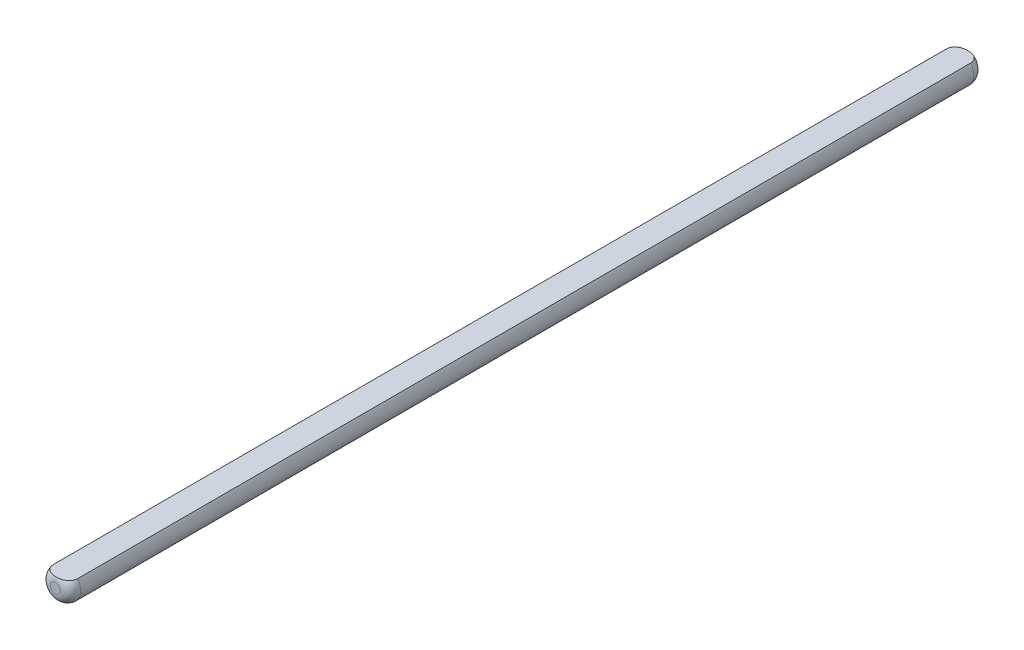
ISO-10303-21;
HEADER;
FILE_DESCRIPTION(('STEP AP214'),'2;1');
FILE_NAME('part.step','',(''),(''),'','','');
FILE_SCHEMA(('AUTOMOTIVE_DESIGN { 1 0 10303 214 1 1 1 1 }'));
ENDSEC;
DATA;
#1=APPLICATION_CONTEXT('core data for automotive mechanical design processes');
#2=APPLICATION_PROTOCOL_DEFINITION('international standard','automotive_design',2000,#1);
#3=PRODUCT_CONTEXT('',#1,'mechanical');
#4=PRODUCT('Part','Part','',(#3));
#5=PRODUCT_RELATED_PRODUCT_CATEGORY('part','',(#4));
#6=PRODUCT_DEFINITION_FORMATION('','',#4);
#7=PRODUCT_DEFINITION_CONTEXT('part definition',#1,'design');
#8=PRODUCT_DEFINITION('design','',#6,#7);
#9=PRODUCT_DEFINITION_SHAPE('','',#8);
#10=(LENGTH_UNIT() NAMED_UNIT(*) SI_UNIT(.MILLI.,.METRE.));
#11=(NAMED_UNIT(*) PLANE_ANGLE_UNIT() SI_UNIT($,.RADIAN.));
#12=(NAMED_UNIT(*) SI_UNIT($,.STERADIAN.) SOLID_ANGLE_UNIT());
#13=UNCERTAINTY_MEASURE_WITH_UNIT(LENGTH_MEASURE(1.E-05),#10,'distance_accuracy_value','');
#14=(GEOMETRIC_REPRESENTATION_CONTEXT(3) GLOBAL_UNCERTAINTY_ASSIGNED_CONTEXT((#13)) GLOBAL_UNIT_ASSIGNED_CONTEXT((#10,
#11,#12)) REPRESENTATION_CONTEXT('',''));
#15=CARTESIAN_POINT('',(0.,0.,0.));
#16=DIRECTION('',(0.,0.,1.));
#17=DIRECTION('',(1.,0.,0.));
#18=AXIS2_PLACEMENT_3D('',#15,#16,#17);
#19=CARTESIAN_POINT('',(0.,0.,180.));
#20=DIRECTION('',(0.,0.,-1.));
#21=DIRECTION('',(-1.,0.,0.));
#22=AXIS2_PLACEMENT_3D('',#19,#20,#21);
#23=CYLINDRICAL_SURFACE('',#22,3.);
#24=CARTESIAN_POINT('',(0.,0.,178.));
#25=DIRECTION('',(0.,0.,1.));
#26=DIRECTION('',(1.,0.,0.));
#27=AXIS2_PLACEMENT_3D('',#24,#25,#26);
#28=CIRCLE('',#27,3.);
#29=CARTESIAN_POINT('',(2.4,1.8,178.));
#30=VERTEX_POINT('',#29);
#31=CARTESIAN_POINT('',(-2.4,1.8,178.));
#32=VERTEX_POINT('',#31);
#33=EDGE_CURVE('E71',#30,#32,#28,.F.);
#34=ORIENTED_EDGE('',*,*,#33,.T.);
#35=DIRECTION('',(0.,0.,-1.));
#36=VECTOR('',#35,1.);
#37=CARTESIAN_POINT('',(-2.4,1.8,180.));
#38=LINE('',#37,#36);
#39=CARTESIAN_POINT('',(-2.4,1.8,1.99999999999989));
#40=VERTEX_POINT('',#39);
#41=EDGE_CURVE('E54',#32,#40,#38,.T.);
#42=ORIENTED_EDGE('',*,*,#41,.T.);
#43=CARTESIAN_POINT('',(0.,0.,1.99999999999989));
#44=DIRECTION('',(0.,0.,1.));
#45=DIRECTION('',(1.,0.,0.));
#46=AXIS2_PLACEMENT_3D('',#43,#44,#45);
#47=CIRCLE('',#46,3.);
#48=CARTESIAN_POINT('',(2.4,1.8,1.99999999999989));
#49=VERTEX_POINT('',#48);
#50=EDGE_CURVE('E73',#40,#49,#47,.T.);
#51=ORIENTED_EDGE('',*,*,#50,.T.);
#52=DIRECTION('',(0.,0.,-1.));
#53=VECTOR('',#52,1.);
#54=CARTESIAN_POINT('',(2.4,1.8,180.));
#55=LINE('',#54,#53);
#56=EDGE_CURVE('E65',#49,#30,#55,.F.);
#57=ORIENTED_EDGE('',*,*,#56,.T.);
#58=EDGE_LOOP('',(#34,#42,#51,#57));
#59=FACE_BOUND('',#58,.T.);
#60=ADVANCED_FACE('F35',(#59),#23,.T.);
#61=CARTESIAN_POINT('',(0.,0.,180.));
#62=DIRECTION('',(0.,0.,1.));
#63=DIRECTION('',(1.,0.,0.));
#64=AXIS2_PLACEMENT_3D('',#61,#62,#63);
#65=PLANE('',#64);
#66=CARTESIAN_POINT('',(0.,0.,180.));
#67=DIRECTION('',(0.,0.,1.));
#68=DIRECTION('',(1.,0.,0.));
#69=AXIS2_PLACEMENT_3D('',#66,#67,#68);
#70=CIRCLE('',#69,1.);
#71=CARTESIAN_POINT('',(1.,0.,180.));
#72=VERTEX_POINT('',#71);
#73=EDGE_CURVE('E48',#72,#72,#70,.T.);
#74=ORIENTED_EDGE('',*,*,#73,.T.);
#75=EDGE_LOOP('',(#74));
#76=FACE_BOUND('',#75,.T.);
#77=ADVANCED_FACE('F89',(#76),#65,.T.);
#78=CARTESIAN_POINT('',(0.,0.,0.));
#79=DIRECTION('',(0.,0.,1.));
#80=DIRECTION('',(1.,0.,0.));
#81=AXIS2_PLACEMENT_3D('',#78,#79,#80);
#82=PLANE('',#81);
#83=CARTESIAN_POINT('',(0.,0.,0.));
#84=DIRECTION('',(0.,0.,1.));
#85=DIRECTION('',(1.,0.,0.));
#86=AXIS2_PLACEMENT_3D('',#83,#84,#85);
#87=CIRCLE('',#86,1.);
#88=CARTESIAN_POINT('',(1.,0.,0.));
#89=VERTEX_POINT('',#88);
#90=EDGE_CURVE('E77',#89,#89,#87,.F.);
#91=ORIENTED_EDGE('',*,*,#90,.T.);
#92=EDGE_LOOP('',(#91));
#93=FACE_BOUND('',#92,.T.);
#94=ADVANCED_FACE('F96',(#93),#82,.F.);
#95=CARTESIAN_POINT('',(0.,0.,2.));
#96=DIRECTION('',(0.,0.,1.));
#97=DIRECTION('',(1.,0.,0.));
#98=AXIS2_PLACEMENT_3D('',#95,#96,#97);
#99=DEGENERATE_TOROIDAL_SURFACE('',#98,1.,2.,.T.);
#100=CARTESIAN_POINT('',(0.,1.8,0.166969722017666));
#101=CARTESIAN_POINT('',(-0.0986785998941134,1.8,0.166975238087045));
#102=CARTESIAN_POINT('',(-0.197346529839382,1.8,0.170477675450817));
#103=CARTESIAN_POINT('',(-0.394209548449965,1.8,0.184913042187482));
#104=CARTESIAN_POINT('',(-0.492404397458323,1.8,0.195849405599045));
#105=CARTESIAN_POINT('',(-0.687200810676761,1.8,0.226181270819594));
#106=CARTESIAN_POINT('',(-0.783806454655332,1.8,0.245549708164188));
#107=CARTESIAN_POINT('',(-0.974465262182511,1.8,0.294071757687691));
#108=CARTESIAN_POINT('',(-1.06852108624494,1.8,0.323214710018872));
#109=CARTESIAN_POINT('',(-1.26583029774225,1.8,0.397560041627408));
#110=CARTESIAN_POINT('',(-1.36845768235951,1.8,0.444470717419789));
#111=CARTESIAN_POINT('',(-1.56509122123428,1.8,0.553888295113033));
#112=CARTESIAN_POINT('',(-1.65910198708867,1.8,0.616386787004061));
#113=CARTESIAN_POINT('',(-1.83552651616728,1.8,0.757508666797526));
#114=CARTESIAN_POINT('',(-1.91784068816743,1.8,0.836257975190657));
#115=CARTESIAN_POINT('',(-2.065979104658,1.8,1.00807150942055));
#116=CARTESIAN_POINT('',(-2.13180888155012,1.8,1.10113091561126));
#117=CARTESIAN_POINT('',(-2.23720083061211,1.8,1.28754255388353));
#118=CARTESIAN_POINT('',(-2.27887474437677,1.8,1.3797028054003));
#119=CARTESIAN_POINT('',(-2.34452577229867,1.8,1.57011541648018));
#120=CARTESIAN_POINT('',(-2.36851347657191,1.8,1.66836409215646));
#121=CARTESIAN_POINT('',(-2.39644764661969,1.8,1.85915363798996));
#122=CARTESIAN_POINT('',(-2.40191765680888,1.8,1.95147438490739));
#123=CARTESIAN_POINT('',(-2.39689553554796,1.8,2.13567111565641));
#124=CARTESIAN_POINT('',(-2.38640678592952,1.8,2.2275471895803));
#125=CARTESIAN_POINT('',(-2.35030117415979,1.8,2.40613408615349));
#126=CARTESIAN_POINT('',(-2.32502501802913,1.8,2.49291427573677));
#127=CARTESIAN_POINT('',(-2.26058356546414,1.8,2.66113019876751));
#128=CARTESIAN_POINT('',(-2.22141882918956,1.8,2.74256614760406));
#129=CARTESIAN_POINT('',(-2.12955683902653,1.8,2.89994959923916));
#130=CARTESIAN_POINT('',(-2.07656511403947,1.8,2.97572467287087));
#131=CARTESIAN_POINT('',(-1.95939791386091,1.8,3.11806122730967));
#132=CARTESIAN_POINT('',(-1.89521774629078,1.8,3.18461882125054));
#133=CARTESIAN_POINT('',(-1.75271671613515,1.8,3.31204250166765));
#134=CARTESIAN_POINT('',(-1.67370313469296,1.8,3.37213038880669));
#135=CARTESIAN_POINT('',(-1.50786459976306,1.8,3.48010981150634));
#136=CARTESIAN_POINT('',(-1.42104320451761,1.8,3.52800686503826));
#137=CARTESIAN_POINT('',(-1.26390306676421,1.8,3.60175998818603));
#138=CARTESIAN_POINT('',(-1.19474255503857,1.8,3.63014162439646));
#139=CARTESIAN_POINT('',(-1.05416593877488,1.8,3.68063819903391));
#140=CARTESIAN_POINT('',(-0.982749379954744,1.8,3.70275186627457));
#141=CARTESIAN_POINT('',(-0.838034036058117,1.8,3.74134266505989));
#142=CARTESIAN_POINT('',(-0.76472741262721,1.8,3.75778998184676));
#143=CARTESIAN_POINT('',(-0.617157947681998,1.8,3.78549164477229));
#144=CARTESIAN_POINT('',(-0.542895096326035,1.8,3.7967459374195));
#145=CARTESIAN_POINT('',(-0.358348827697383,1.8,3.81888706504936));
#146=CARTESIAN_POINT('',(-0.247737219781189,1.8,3.82705178049354));
#147=CARTESIAN_POINT('',(-0.0261563081097725,1.8,3.83445046479966));
#148=CARTESIAN_POINT('',(0.0848132146458741,1.8,3.83367710165681));
#149=CARTESIAN_POINT('',(0.306020069167074,1.8,3.82307860982982));
#150=CARTESIAN_POINT('',(0.416258594625243,1.8,3.8132801259526));
#151=CARTESIAN_POINT('',(0.635242041818319,1.8,3.7833889265005));
#152=CARTESIAN_POINT('',(0.74398862547722,1.8,3.76330881655314));
#153=CARTESIAN_POINT('',(0.970440557346135,1.8,3.70805597598123));
#154=CARTESIAN_POINT('',(1.08781482330207,1.8,3.6714655182648));
#155=CARTESIAN_POINT('',(1.31559913991839,1.8,3.58089149859709));
#156=CARTESIAN_POINT('',(1.42602039299972,1.8,3.52693681748993));
#157=CARTESIAN_POINT('',(1.63698214306462,1.8,3.39965509628724));
#158=CARTESIAN_POINT('',(1.73739712118393,1.8,3.32611638038127));
#159=CARTESIAN_POINT('',(1.92177182460297,1.8,3.16048672940832));
#160=CARTESIAN_POINT('',(2.00573510880869,1.8,3.06839981553315));
#161=CARTESIAN_POINT('',(2.14170378773492,1.8,2.88268700099884));
#162=CARTESIAN_POINT('',(2.19655590053385,1.8,2.7911424114992));
#163=CARTESIAN_POINT('',(2.28775023694629,1.8,2.59927472144413));
#164=CARTESIAN_POINT('',(2.32410951262713,1.8,2.49895980833114));
#165=CARTESIAN_POINT('',(2.37344556135317,1.8,2.30513950926308));
#166=CARTESIAN_POINT('',(2.38864566212387,1.8,2.2121942845736));
#167=CARTESIAN_POINT('',(2.40254652843964,1.8,2.02508558426061));
#168=CARTESIAN_POINT('',(2.40125250179713,1.8,1.93092250254016));
#169=CARTESIAN_POINT('',(2.38259230347494,1.8,1.74786718588304));
#170=CARTESIAN_POINT('',(2.36584296863454,1.8,1.65891112953878));
#171=CARTESIAN_POINT('',(2.3177948786314,1.8,1.48503513443969));
#172=CARTESIAN_POINT('',(2.28649679833613,1.8,1.40011500867296));
#173=CARTESIAN_POINT('',(2.21011098434111,1.8,1.23563696772895));
#174=CARTESIAN_POINT('',(2.16487938683766,1.8,1.15614609480629));
#175=CARTESIAN_POINT('',(2.06239114822016,1.8,1.00536938877244));
#176=CARTESIAN_POINT('',(2.00513292643795,1.8,0.934084636106137));
#177=CARTESIAN_POINT('',(1.87694794583827,1.8,0.797209267821054));
#178=CARTESIAN_POINT('',(1.80542713631104,1.8,0.732176714614894));
#179=CARTESIAN_POINT('',(1.6535258887066,1.8,0.613512927513511));
#180=CARTESIAN_POINT('',(1.57314145111642,1.8,0.559886872774925));
#181=CARTESIAN_POINT('',(1.37120696379265,1.8,0.444290804678226));
#182=CARTESIAN_POINT('',(1.24637956290656,1.8,0.388040119487766));
#183=CARTESIAN_POINT('',(0.98937668255887,1.8,0.29647614284008));
#184=CARTESIAN_POINT('',(0.857190636952699,1.8,0.261193854321601));
#185=CARTESIAN_POINT('',(0.604491105474045,1.8,0.211015292219229));
#186=CARTESIAN_POINT('',(0.484321810099184,1.8,0.194282993609103));
#187=CARTESIAN_POINT('',(0.242764158095313,1.8,0.172246586378911));
#188=CARTESIAN_POINT('',(0.121374007853963,1.8,0.166962937289783));
#189=CARTESIAN_POINT('',(0.,1.8,0.166969722017666));
#190=B_SPLINE_CURVE_WITH_KNOTS('',3,(#100,#101,#102,#103,#104,#105,#106,#107,#108,#109,#110,
#111,#112,#113,#114,#115,#116,#117,#118,#119,#120,#121,#122,#123,#124,#125,#126,#127,#128,#129,
#130,#131,#132,#133,#134,#135,#136,#137,#138,#139,#140,#141,#142,#143,#144,#145,#146,#147,#148,
#149,#150,#151,#152,#153,#154,#155,#156,#157,#158,#159,#160,#161,#162,#163,#164,#165,#166,#167,
#168,#169,#170,#171,#172,#173,#174,#175,#176,#177,#178,#179,#180,#181,#182,#183,#184,#185,#186,
#187,#188,#189),.UNSPECIFIED.,.T.,.F.,(4,2,2,2,2,2,2,2,2,2,2,2,2,2,2,2,2,2,2,2,2,2,2,2,2,2,2,2,
2,2,2,2,2,2,2,2,2,2,2,2,2,2,2,2,4),(0.,0.295949653695499,0.592036111796914,0.887179146832613,
1.18200134704731,1.51927976293908,1.85637660099008,2.19619075075287,2.5358907006511,
2.83767550406189,3.13927945824436,3.41537263411145,3.6914073110335,3.96131945882432,
4.2312207216487,4.50742049637946,4.78373638786554,5.0803670815448,5.3768632707044,
5.60083274182996,5.82484760302653,6.05002378312747,6.27520228263474,6.60750999736436,
6.9400903271253,7.2716919184159,7.60288792476429,7.97053125870932,8.33756624716975,
8.70874180895325,9.07983698747111,9.39815717912841,9.71618331622703,9.99731399926407,
10.278355921038,10.5486447906642,10.8189211237476,11.0920873088679,11.3652894189135,
11.6541014321146,11.9430443027048,12.351468674033,12.7604954307166,13.1238626665679,
13.4878787311509),.UNSPECIFIED.);
#191=EDGE_CURVE('E59',#49,#40,#190,.T.);
#192=ORIENTED_EDGE('',*,*,#191,.F.);
#193=ORIENTED_EDGE('',*,*,#50,.F.);
#194=EDGE_LOOP('',(#192,#193));
#195=FACE_BOUND('',#194,.T.);
#196=ORIENTED_EDGE('',*,*,#90,.F.);
#197=EDGE_LOOP('',(#196));
#198=FACE_BOUND('',#197,.T.);
#199=ADVANCED_FACE('F91',(#195,#198),#99,.T.);
#200=CARTESIAN_POINT('',(0.,0.,178.));
#201=DIRECTION('',(0.,0.,1.));
#202=DIRECTION('',(1.,0.,0.));
#203=AXIS2_PLACEMENT_3D('',#200,#201,#202);
#204=DEGENERATE_TOROIDAL_SURFACE('',#203,1.,2.,.T.);
#205=CARTESIAN_POINT('',(0.,1.8,179.833030277982));
#206=CARTESIAN_POINT('',(0.0986785998941123,1.8,179.833024761913));
#207=CARTESIAN_POINT('',(0.19734652983938,1.8,179.829522324549));
#208=CARTESIAN_POINT('',(0.394209548449963,1.8,179.815086957812));
#209=CARTESIAN_POINT('',(0.492404397458321,1.8,179.804150594401));
#210=CARTESIAN_POINT('',(0.687200810676758,1.8,179.77381872918));
#211=CARTESIAN_POINT('',(0.783806454655327,1.8,179.754450291836));
#212=CARTESIAN_POINT('',(0.974465262182507,1.8,179.705928242312));
#213=CARTESIAN_POINT('',(1.06852108624494,1.8,179.676785289981));
#214=CARTESIAN_POINT('',(1.26583029774225,1.8,179.602439958373));
#215=CARTESIAN_POINT('',(1.36845768235951,1.8,179.55552928258));
#216=CARTESIAN_POINT('',(1.56509122123427,1.8,179.446111704887));
#217=CARTESIAN_POINT('',(1.65910198708867,1.8,179.383613212996));
#218=CARTESIAN_POINT('',(1.83552651616729,1.8,179.242491333202));
#219=CARTESIAN_POINT('',(1.91784068816743,1.8,179.163742024809));
#220=CARTESIAN_POINT('',(2.06597910465799,1.8,178.991928490579));
#221=CARTESIAN_POINT('',(2.13180888155012,1.8,178.898869084389));
#222=CARTESIAN_POINT('',(2.23720083061211,1.8,178.712457446116));
#223=CARTESIAN_POINT('',(2.27887474437677,1.8,178.6202971946));
#224=CARTESIAN_POINT('',(2.34452577229868,1.8,178.42988458352));
#225=CARTESIAN_POINT('',(2.36851347657191,1.8,178.331635907844));
#226=CARTESIAN_POINT('',(2.39644764661969,1.8,178.14084636201));
#227=CARTESIAN_POINT('',(2.40191765680888,1.8,178.048525615093));
#228=CARTESIAN_POINT('',(2.39689553554796,1.8,177.864328884344));
#229=CARTESIAN_POINT('',(2.38640678592952,1.8,177.77245281042));
#230=CARTESIAN_POINT('',(2.3503011741598,1.8,177.593865913847));
#231=CARTESIAN_POINT('',(2.32502501802914,1.8,177.507085724263));
#232=CARTESIAN_POINT('',(2.26058356546414,1.8,177.338869801233));
#233=CARTESIAN_POINT('',(2.22141882918955,1.8,177.257433852396));
#234=CARTESIAN_POINT('',(2.12955683902652,1.8,177.100050400761));
#235=CARTESIAN_POINT('',(2.07656511403947,1.8,177.024275327129));
#236=CARTESIAN_POINT('',(1.9593979138609,1.8,176.88193877269));
#237=CARTESIAN_POINT('',(1.89521774629078,1.8,176.815381178749));
#238=CARTESIAN_POINT('',(1.75271671613514,1.8,176.687957498332));
#239=CARTESIAN_POINT('',(1.67370313469295,1.8,176.627869611193));
#240=CARTESIAN_POINT('',(1.50786459976304,1.8,176.519890188494));
#241=CARTESIAN_POINT('',(1.4210432045176,1.8,176.471993134962));
#242=CARTESIAN_POINT('',(1.2639030667642,1.8,176.398240011814));
#243=CARTESIAN_POINT('',(1.19474255503856,1.8,176.369858375604));
#244=CARTESIAN_POINT('',(1.05416593877488,1.8,176.319361800966));
#245=CARTESIAN_POINT('',(0.982749379954741,1.8,176.297248133725));
#246=CARTESIAN_POINT('',(0.838034036058114,1.8,176.25865733494));
#247=CARTESIAN_POINT('',(0.764727412627206,1.8,176.242210018153));
#248=CARTESIAN_POINT('',(0.617157947681993,1.8,176.214508355228));
#249=CARTESIAN_POINT('',(0.542895096326029,1.8,176.20325406258));
#250=CARTESIAN_POINT('',(0.358348827697375,1.8,176.181112934951));
#251=CARTESIAN_POINT('',(0.247737219781181,1.8,176.172948219506));
#252=CARTESIAN_POINT('',(0.0261563081097642,1.8,176.1655495352));
#253=CARTESIAN_POINT('',(-0.0848132146458821,1.8,176.166322898343));
#254=CARTESIAN_POINT('',(-0.306020069167081,1.8,176.17692139017));
#255=CARTESIAN_POINT('',(-0.41625859462525,1.8,176.186719874047));
#256=CARTESIAN_POINT('',(-0.635242041818325,1.8,176.2166110735));
#257=CARTESIAN_POINT('',(-0.743988625477225,1.8,176.236691183447));
#258=CARTESIAN_POINT('',(-0.970440557346137,1.8,176.291944024019));
#259=CARTESIAN_POINT('',(-1.08781482330207,1.8,176.328534481735));
#260=CARTESIAN_POINT('',(-1.31559913991839,1.8,176.419108501403));
#261=CARTESIAN_POINT('',(-1.42602039299972,1.8,176.47306318251));
#262=CARTESIAN_POINT('',(-1.63698214306461,1.8,176.600344903713));
#263=CARTESIAN_POINT('',(-1.73739712118391,1.8,176.673883619619));
#264=CARTESIAN_POINT('',(-1.92177182460297,1.8,176.839513270592));
#265=CARTESIAN_POINT('',(-2.0057351088087,1.8,176.931600184467));
#266=CARTESIAN_POINT('',(-2.14170378773493,1.8,177.117312999001));
#267=CARTESIAN_POINT('',(-2.19655590053386,1.8,177.208857588501));
#268=CARTESIAN_POINT('',(-2.28775023694629,1.8,177.400725278556));
#269=CARTESIAN_POINT('',(-2.32410951262713,1.8,177.501040191669));
#270=CARTESIAN_POINT('',(-2.37344556135318,1.8,177.694860490737));
#271=CARTESIAN_POINT('',(-2.38864566212387,1.8,177.787805715426));
#272=CARTESIAN_POINT('',(-2.40254652843964,1.8,177.974914415739));
#273=CARTESIAN_POINT('',(-2.40125250179712,1.8,178.06907749746));
#274=CARTESIAN_POINT('',(-2.38259230347494,1.8,178.252132814117));
#275=CARTESIAN_POINT('',(-2.36584296863455,1.8,178.341088870461));
#276=CARTESIAN_POINT('',(-2.31779487863141,1.8,178.51496486556));
#277=CARTESIAN_POINT('',(-2.28649679833614,1.8,178.599884991327));
#278=CARTESIAN_POINT('',(-2.21011098434111,1.8,178.764363032271));
#279=CARTESIAN_POINT('',(-2.16487938683766,1.8,178.843853905194));
#280=CARTESIAN_POINT('',(-2.06239114822017,1.8,178.994630611228));
#281=CARTESIAN_POINT('',(-2.00513292643796,1.8,179.065915363894));
#282=CARTESIAN_POINT('',(-1.87694794583828,1.8,179.202790732179));
#283=CARTESIAN_POINT('',(-1.80542713631105,1.8,179.267823285385));
#284=CARTESIAN_POINT('',(-1.6535258887066,1.8,179.386487072486));
#285=CARTESIAN_POINT('',(-1.57314145111641,1.8,179.440113127225));
#286=CARTESIAN_POINT('',(-1.37120696379265,1.8,179.555709195322));
#287=CARTESIAN_POINT('',(-1.24637956290655,1.8,179.611959880512));
#288=CARTESIAN_POINT('',(-0.98937668255886,1.8,179.70352385716));
#289=CARTESIAN_POINT('',(-0.857190636952684,1.8,179.738806145678));
#290=CARTESIAN_POINT('',(-0.604491105474028,1.8,179.788984707781));
#291=CARTESIAN_POINT('',(-0.48432181009917,1.8,179.805717006391));
#292=CARTESIAN_POINT('',(-0.242764158095306,1.8,179.827753413621));
#293=CARTESIAN_POINT('',(-0.12137400785396,1.8,179.83303706271));
#294=CARTESIAN_POINT('',(0.,1.8,179.833030277982));
#295=B_SPLINE_CURVE_WITH_KNOTS('',3,(#205,#206,#207,#208,#209,#210,#211,#212,#213,#214,#215,
#216,#217,#218,#219,#220,#221,#222,#223,#224,#225,#226,#227,#228,#229,#230,#231,#232,#233,#234,
#235,#236,#237,#238,#239,#240,#241,#242,#243,#244,#245,#246,#247,#248,#249,#250,#251,#252,#253,
#254,#255,#256,#257,#258,#259,#260,#261,#262,#263,#264,#265,#266,#267,#268,#269,#270,#271,#272,
#273,#274,#275,#276,#277,#278,#279,#280,#281,#282,#283,#284,#285,#286,#287,#288,#289,#290,#291,
#292,#293,#294),.UNSPECIFIED.,.T.,.F.,(4,2,2,2,2,2,2,2,2,2,2,2,2,2,2,2,2,2,2,2,2,2,2,2,2,2,2,2,
2,2,2,2,2,2,2,2,2,2,2,2,2,2,2,2,4),(0.,0.295949653695496,0.59203611179691,0.887179146832611,
1.1820013470473,1.51927976293908,1.85637660099007,2.19619075075287,2.53589070065112,
2.83767550406188,3.13927945824433,3.41537263411142,3.69140731103349,3.96131945882427,
4.23122072164871,4.50742049637948,4.78373638786555,5.0803670815448,5.3768632707044,
5.60083274182996,5.82484760302653,6.05002378312747,6.27520228263474,6.60750999736436,
6.9400903271253,7.2716919184159,7.60288792476429,7.9705312587093,8.33756624716975,
8.70874180895321,9.07983698747112,9.39815717912843,9.71618331622701,9.99731399926408,
10.278355921038,10.5486447906641,10.8189211237476,11.0920873088679,11.3652894189135,
11.6541014321146,11.9430443027048,12.351468674033,12.7604954307166,13.1238626665679,
13.4878787311509),.UNSPECIFIED.);
#296=EDGE_CURVE('E11',#32,#30,#295,.T.);
#297=ORIENTED_EDGE('',*,*,#296,.F.);
#298=ORIENTED_EDGE('',*,*,#33,.F.);
#299=EDGE_LOOP('',(#297,#298));
#300=FACE_BOUND('',#299,.T.);
#301=ORIENTED_EDGE('',*,*,#73,.F.);
#302=EDGE_LOOP('',(#301));
#303=FACE_BOUND('',#302,.T.);
#304=ADVANCED_FACE('F37',(#300,#303),#204,.T.);
#305=CARTESIAN_POINT('',(-3.,1.8,0.));
#306=DIRECTION('',(0.,-1.,0.));
#307=DIRECTION('',(0.,0.,-1.));
#308=AXIS2_PLACEMENT_3D('',#305,#306,#307);
#309=PLANE('',#308);
#310=ORIENTED_EDGE('',*,*,#191,.T.);
#311=ORIENTED_EDGE('',*,*,#41,.F.);
#312=ORIENTED_EDGE('',*,*,#296,.T.);
#313=ORIENTED_EDGE('',*,*,#56,.F.);
#314=EDGE_LOOP('',(#310,#311,#312,#313));
#315=FACE_BOUND('',#314,.T.);
#316=ADVANCED_FACE('F64',(#315),#309,.F.);
#317=CLOSED_SHELL('',(#60,#77,#94,#199,#304,#316));
#318=MANIFOLD_SOLID_BREP('B2',#317);
#319=ADVANCED_BREP_SHAPE_REPRESENTATION('',(#18,#318),#14);
#320=SHAPE_DEFINITION_REPRESENTATION(#9,#319);
ENDSEC;
END-ISO-10303-21;
